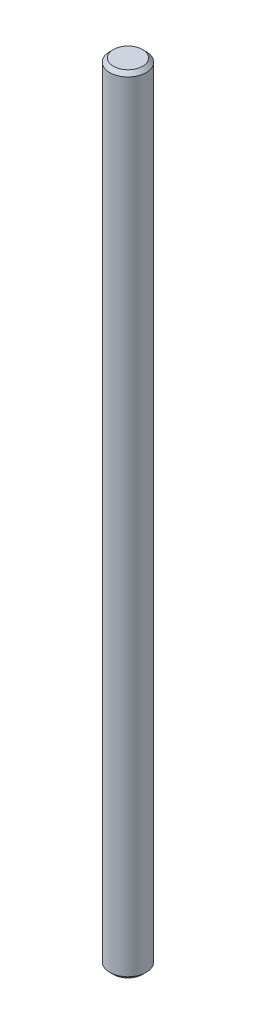
ISO-10303-21;
HEADER;
FILE_DESCRIPTION(('STEP AP214'),'2;1');
FILE_NAME('part.step','',(''),(''),'','','');
FILE_SCHEMA(('AUTOMOTIVE_DESIGN { 1 0 10303 214 1 1 1 1 }'));
ENDSEC;
DATA;
#1=APPLICATION_CONTEXT('core data for automotive mechanical design processes');
#2=APPLICATION_PROTOCOL_DEFINITION('international standard','automotive_design',2000,#1);
#3=PRODUCT_CONTEXT('',#1,'mechanical');
#4=PRODUCT('Part','Part','',(#3));
#5=PRODUCT_RELATED_PRODUCT_CATEGORY('part','',(#4));
#6=PRODUCT_DEFINITION_FORMATION('','',#4);
#7=PRODUCT_DEFINITION_CONTEXT('part definition',#1,'design');
#8=PRODUCT_DEFINITION('design','',#6,#7);
#9=PRODUCT_DEFINITION_SHAPE('','',#8);
#10=(LENGTH_UNIT() NAMED_UNIT(*) SI_UNIT(.MILLI.,.METRE.));
#11=(NAMED_UNIT(*) PLANE_ANGLE_UNIT() SI_UNIT($,.RADIAN.));
#12=(NAMED_UNIT(*) SI_UNIT($,.STERADIAN.) SOLID_ANGLE_UNIT());
#13=UNCERTAINTY_MEASURE_WITH_UNIT(LENGTH_MEASURE(1.E-05),#10,'distance_accuracy_value','');
#14=(GEOMETRIC_REPRESENTATION_CONTEXT(3) GLOBAL_UNCERTAINTY_ASSIGNED_CONTEXT((#13)) GLOBAL_UNIT_ASSIGNED_CONTEXT((#10,
#11,#12)) REPRESENTATION_CONTEXT('',''));
#15=CARTESIAN_POINT('',(0.,0.,0.));
#16=DIRECTION('',(0.,0.,1.));
#17=DIRECTION('',(1.,0.,0.));
#18=AXIS2_PLACEMENT_3D('',#15,#16,#17);
#19=CARTESIAN_POINT('',(0.,108.,0.));
#20=DIRECTION('',(0.,-1.,0.));
#21=DIRECTION('',(0.,0.,-1.));
#22=AXIS2_PLACEMENT_3D('',#19,#20,#21);
#23=CYLINDRICAL_SURFACE('',#22,2.5);
#24=CARTESIAN_POINT('',(0.,0.499999999999987,0.));
#25=DIRECTION('',(0.,1.,0.));
#26=DIRECTION('',(0.,0.,1.));
#27=AXIS2_PLACEMENT_3D('',#24,#25,#26);
#28=CIRCLE('',#27,2.5);
#29=CARTESIAN_POINT('',(0.,0.499999999999987,2.5));
#30=VERTEX_POINT('',#29);
#31=EDGE_CURVE('E47',#30,#30,#28,.T.);
#32=ORIENTED_EDGE('',*,*,#31,.T.);
#33=EDGE_LOOP('',(#32));
#34=FACE_BOUND('',#33,.T.);
#35=CARTESIAN_POINT('',(0.,107.5,0.));
#36=DIRECTION('',(0.,1.,0.));
#37=DIRECTION('',(0.,0.,1.));
#38=AXIS2_PLACEMENT_3D('',#35,#36,#37);
#39=CIRCLE('',#38,2.5);
#40=CARTESIAN_POINT('',(0.,107.5,2.5));
#41=VERTEX_POINT('',#40);
#42=EDGE_CURVE('E51',#41,#41,#39,.F.);
#43=ORIENTED_EDGE('',*,*,#42,.T.);
#44=EDGE_LOOP('',(#43));
#45=FACE_BOUND('',#44,.T.);
#46=ADVANCED_FACE('F35',(#34,#45),#23,.T.);
#47=CARTESIAN_POINT('',(0.,108.,0.));
#48=DIRECTION('',(0.,1.,0.));
#49=DIRECTION('',(0.,0.,1.));
#50=AXIS2_PLACEMENT_3D('',#47,#48,#49);
#51=PLANE('',#50);
#52=CARTESIAN_POINT('',(0.,108.,0.));
#53=DIRECTION('',(0.,1.,0.));
#54=DIRECTION('',(0.,0.,1.));
#55=AXIS2_PLACEMENT_3D('',#52,#53,#54);
#56=CIRCLE('',#55,2.);
#57=CARTESIAN_POINT('',(0.,108.,2.));
#58=VERTEX_POINT('',#57);
#59=EDGE_CURVE('E10',#58,#58,#56,.T.);
#60=ORIENTED_EDGE('',*,*,#59,.T.);
#61=EDGE_LOOP('',(#60));
#62=FACE_BOUND('',#61,.T.);
#63=ADVANCED_FACE('F67',(#62),#51,.T.);
#64=CARTESIAN_POINT('',(0.,0.,0.));
#65=DIRECTION('',(0.,1.,0.));
#66=DIRECTION('',(0.,0.,1.));
#67=AXIS2_PLACEMENT_3D('',#64,#65,#66);
#68=PLANE('',#67);
#69=CARTESIAN_POINT('',(0.,0.,0.));
#70=DIRECTION('',(0.,1.,0.));
#71=DIRECTION('',(0.,0.,1.));
#72=AXIS2_PLACEMENT_3D('',#69,#70,#71);
#73=CIRCLE('',#72,2.00000000000002);
#74=CARTESIAN_POINT('',(0.,0.,2.00000000000002));
#75=VERTEX_POINT('',#74);
#76=EDGE_CURVE('E43',#75,#75,#73,.F.);
#77=ORIENTED_EDGE('',*,*,#76,.T.);
#78=EDGE_LOOP('',(#77));
#79=FACE_BOUND('',#78,.T.);
#80=ADVANCED_FACE('F64',(#79),#68,.F.);
#81=CARTESIAN_POINT('',(0.,0.499999999999987,0.));
#82=DIRECTION('',(0.,1.,0.));
#83=DIRECTION('',(0.,0.,1.));
#84=AXIS2_PLACEMENT_3D('',#81,#82,#83);
#85=CONICAL_SURFACE('',#84,2.5,0.785398163397446);
#86=ORIENTED_EDGE('',*,*,#76,.F.);
#87=EDGE_LOOP('',(#86));
#88=FACE_BOUND('',#87,.T.);
#89=ORIENTED_EDGE('',*,*,#31,.F.);
#90=EDGE_LOOP('',(#89));
#91=FACE_BOUND('',#90,.T.);
#92=ADVANCED_FACE('F60',(#88,#91),#85,.T.);
#93=CARTESIAN_POINT('',(0.,108.,0.));
#94=DIRECTION('',(0.,-1.,0.));
#95=DIRECTION('',(0.,0.,-1.));
#96=AXIS2_PLACEMENT_3D('',#93,#94,#95);
#97=CONICAL_SURFACE('',#96,2.,0.78539816339746);
#98=ORIENTED_EDGE('',*,*,#42,.F.);
#99=EDGE_LOOP('',(#98));
#100=FACE_BOUND('',#99,.T.);
#101=ORIENTED_EDGE('',*,*,#59,.F.);
#102=EDGE_LOOP('',(#101));
#103=FACE_BOUND('',#102,.T.);
#104=ADVANCED_FACE('F38',(#100,#103),#97,.T.);
#105=CLOSED_SHELL('',(#46,#63,#80,#92,#104));
#106=MANIFOLD_SOLID_BREP('B2',#105);
#107=ADVANCED_BREP_SHAPE_REPRESENTATION('',(#18,#106),#14);
#108=SHAPE_DEFINITION_REPRESENTATION(#9,#107);
ENDSEC;
END-ISO-10303-21;
